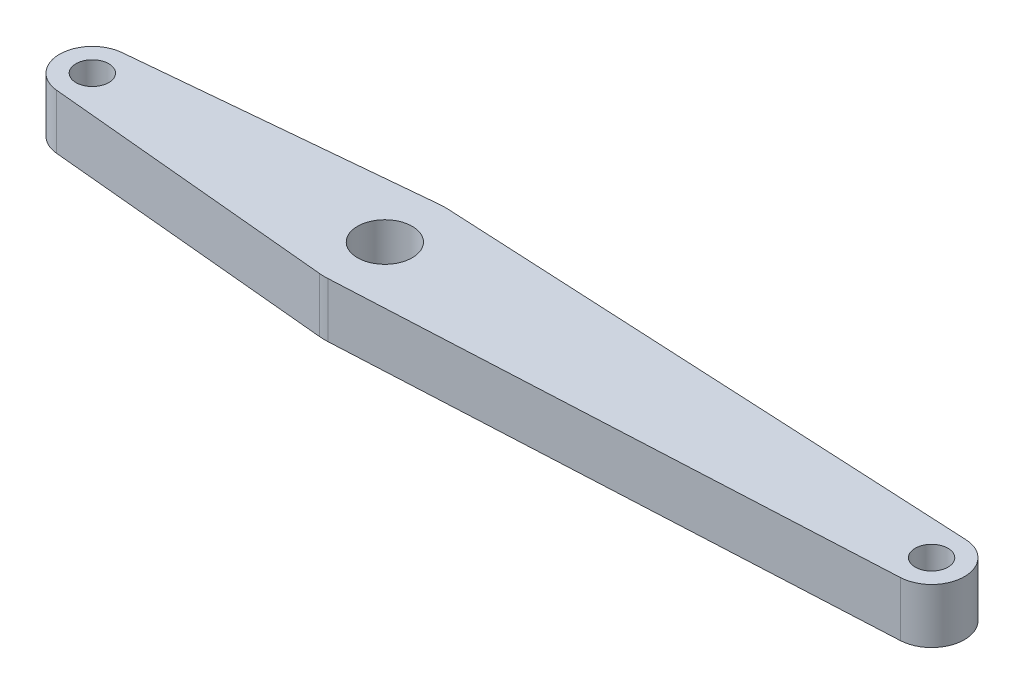
ISO-10303-21;
HEADER;
FILE_DESCRIPTION(('STEP AP214'),'2;1');
FILE_NAME('part.step','',(''),(''),'','','');
FILE_SCHEMA(('AUTOMOTIVE_DESIGN { 1 0 10303 214 1 1 1 1 }'));
ENDSEC;
DATA;
#1=APPLICATION_CONTEXT('core data for automotive mechanical design processes');
#2=APPLICATION_PROTOCOL_DEFINITION('international standard','automotive_design',2000,#1);
#3=PRODUCT_CONTEXT('',#1,'mechanical');
#4=PRODUCT('Part','Part','',(#3));
#5=PRODUCT_RELATED_PRODUCT_CATEGORY('part','',(#4));
#6=PRODUCT_DEFINITION_FORMATION('','',#4);
#7=PRODUCT_DEFINITION_CONTEXT('part definition',#1,'design');
#8=PRODUCT_DEFINITION('design','',#6,#7);
#9=PRODUCT_DEFINITION_SHAPE('','',#8);
#10=(LENGTH_UNIT() NAMED_UNIT(*) SI_UNIT(.MILLI.,.METRE.));
#11=(NAMED_UNIT(*) PLANE_ANGLE_UNIT() SI_UNIT($,.RADIAN.));
#12=(NAMED_UNIT(*) SI_UNIT($,.STERADIAN.) SOLID_ANGLE_UNIT());
#13=UNCERTAINTY_MEASURE_WITH_UNIT(LENGTH_MEASURE(1.E-05),#10,'distance_accuracy_value','');
#14=(GEOMETRIC_REPRESENTATION_CONTEXT(3) GLOBAL_UNCERTAINTY_ASSIGNED_CONTEXT((#13)) GLOBAL_UNIT_ASSIGNED_CONTEXT((#10,
#11,#12)) REPRESENTATION_CONTEXT('',''));
#15=CARTESIAN_POINT('',(0.,0.,0.));
#16=DIRECTION('',(0.,0.,1.));
#17=DIRECTION('',(1.,0.,0.));
#18=AXIS2_PLACEMENT_3D('',#15,#16,#17);
#19=CARTESIAN_POINT('',(100.,5.,0.));
#20=DIRECTION('',(0.,1.,0.));
#21=DIRECTION('',(0.,0.,1.));
#22=AXIS2_PLACEMENT_3D('',#19,#20,#21);
#23=PLANE('',#22);
#24=CARTESIAN_POINT('',(100.,5.,0.));
#25=DIRECTION('',(0.,1.,0.));
#26=DIRECTION('',(0.,0.,1.));
#27=AXIS2_PLACEMENT_3D('',#24,#25,#26);
#28=CIRCLE('',#27,3.00000000000001);
#29=CARTESIAN_POINT('',(100.,5.,3.00000000000001));
#30=VERTEX_POINT('',#29);
#31=EDGE_CURVE('E190',#30,#30,#28,.T.);
#32=ORIENTED_EDGE('',*,*,#31,.F.);
#33=EDGE_LOOP('',(#32));
#34=FACE_BOUND('',#33,.T.);
#35=CARTESIAN_POINT('',(100.,5.,0.));
#36=DIRECTION('',(0.,1.,0.));
#37=DIRECTION('',(0.,0.,1.));
#38=AXIS2_PLACEMENT_3D('',#35,#36,#37);
#39=CIRCLE('',#38,6.);
#40=CARTESIAN_POINT('',(100.3,5.,5.99249530663146));
#41=VERTEX_POINT('',#40);
#42=CARTESIAN_POINT('',(100.3,5.,-5.99249530663146));
#43=VERTEX_POINT('',#42);
#44=EDGE_CURVE('E153',#41,#43,#39,.T.);
#45=ORIENTED_EDGE('',*,*,#44,.T.);
#46=DIRECTION('',(-0.998749217771909,0.,-0.05));
#47=VECTOR('',#46,1.);
#48=CARTESIAN_POINT('',(100.3,5.,-5.99249530663146));
#49=LINE('',#48,#47);
#50=CARTESIAN_POINT('',(0.55,5.,-10.986241395491));
#51=VERTEX_POINT('',#50);
#52=EDGE_CURVE('E101',#43,#51,#49,.T.);
#53=ORIENTED_EDGE('',*,*,#52,.T.);
#54=CARTESIAN_POINT('',(0.,5.,0.));
#55=DIRECTION('',(0.,1.,0.));
#56=DIRECTION('',(0.,0.,1.));
#57=AXIS2_PLACEMENT_3D('',#54,#55,#56);
#58=CIRCLE('',#57,11.);
#59=CARTESIAN_POINT('',(-1.02803738317757,5.,-10.9518555112268));
#60=VERTEX_POINT('',#59);
#61=EDGE_CURVE('E168',#51,#60,#58,.T.);
#62=ORIENTED_EDGE('',*,*,#61,.T.);
#63=DIRECTION('',(-0.995623228293348,0.,0.0934579439252337));
#64=VECTOR('',#63,1.);
#65=CARTESIAN_POINT('',(-54.0607476635514,5.,-5.97373936976008));
#66=LINE('',#65,#64);
#67=CARTESIAN_POINT('',(-54.0607476635514,5.,-5.97373936976008));
#68=VERTEX_POINT('',#67);
#69=EDGE_CURVE('E181',#60,#68,#66,.T.);
#70=ORIENTED_EDGE('',*,*,#69,.T.);
#71=CARTESIAN_POINT('',(-53.5,5.,0.));
#72=DIRECTION('',(0.,1.,0.));
#73=DIRECTION('',(0.,0.,1.));
#74=AXIS2_PLACEMENT_3D('',#71,#72,#73);
#75=CIRCLE('',#74,5.99999999999999);
#76=CARTESIAN_POINT('',(-54.0607476635514,5.,5.97373936976009));
#77=VERTEX_POINT('',#76);
#78=EDGE_CURVE('E120',#68,#77,#75,.T.);
#79=ORIENTED_EDGE('',*,*,#78,.T.);
#80=DIRECTION('',(0.995623228293348,0.,0.0934579439252337));
#81=VECTOR('',#80,1.);
#82=CARTESIAN_POINT('',(-54.0607476635514,5.,5.97373936976008));
#83=LINE('',#82,#81);
#84=CARTESIAN_POINT('',(-1.02803738317757,5.,10.9518555112268));
#85=VERTEX_POINT('',#84);
#86=EDGE_CURVE('E114',#77,#85,#83,.T.);
#87=ORIENTED_EDGE('',*,*,#86,.T.);
#88=CARTESIAN_POINT('',(0.,5.,0.));
#89=DIRECTION('',(0.,1.,0.));
#90=DIRECTION('',(0.,0.,1.));
#91=AXIS2_PLACEMENT_3D('',#88,#89,#90);
#92=CIRCLE('',#91,11.);
#93=CARTESIAN_POINT('',(0.550000000000003,5.,10.986241395491));
#94=VERTEX_POINT('',#93);
#95=EDGE_CURVE('E118',#85,#94,#92,.T.);
#96=ORIENTED_EDGE('',*,*,#95,.T.);
#97=DIRECTION('',(0.998749217771909,0.,-0.05));
#98=VECTOR('',#97,1.);
#99=CARTESIAN_POINT('',(100.3,5.,5.99249530663146));
#100=LINE('',#99,#98);
#101=EDGE_CURVE('E58',#94,#41,#100,.T.);
#102=ORIENTED_EDGE('',*,*,#101,.T.);
#103=EDGE_LOOP('',(#45,#53,#62,#70,#79,#87,#96,#102));
#104=FACE_BOUND('',#103,.T.);
#105=CARTESIAN_POINT('',(-53.5,5.,0.));
#106=DIRECTION('',(0.,1.,0.));
#107=DIRECTION('',(0.,0.,1.));
#108=AXIS2_PLACEMENT_3D('',#105,#106,#107);
#109=CIRCLE('',#108,2.99999999999999);
#110=CARTESIAN_POINT('',(-53.5,5.,3.));
#111=VERTEX_POINT('',#110);
#112=EDGE_CURVE('E142',#111,#111,#109,.T.);
#113=ORIENTED_EDGE('',*,*,#112,.F.);
#114=EDGE_LOOP('',(#113));
#115=FACE_BOUND('',#114,.T.);
#116=CARTESIAN_POINT('',(0.,5.,0.));
#117=DIRECTION('',(0.,1.,0.));
#118=DIRECTION('',(0.,0.,1.));
#119=AXIS2_PLACEMENT_3D('',#116,#117,#118);
#120=CIRCLE('',#119,5.);
#121=CARTESIAN_POINT('',(0.,5.,5.));
#122=VERTEX_POINT('',#121);
#123=EDGE_CURVE('E196',#122,#122,#120,.T.);
#124=ORIENTED_EDGE('',*,*,#123,.F.);
#125=EDGE_LOOP('',(#124));
#126=FACE_BOUND('',#125,.T.);
#127=ADVANCED_FACE('F41',(#34,#104,#115,#126),#23,.T.);
#128=CARTESIAN_POINT('',(100.,-5.,0.));
#129=DIRECTION('',(0.,1.,0.));
#130=DIRECTION('',(0.,0.,1.));
#131=AXIS2_PLACEMENT_3D('',#128,#129,#130);
#132=PLANE('',#131);
#133=CARTESIAN_POINT('',(100.,-5.,0.));
#134=DIRECTION('',(0.,1.,0.));
#135=DIRECTION('',(0.,0.,1.));
#136=AXIS2_PLACEMENT_3D('',#133,#134,#135);
#137=CIRCLE('',#136,6.);
#138=CARTESIAN_POINT('',(100.3,-5.,5.99249530663146));
#139=VERTEX_POINT('',#138);
#140=CARTESIAN_POINT('',(100.3,-5.,-5.99249530663146));
#141=VERTEX_POINT('',#140);
#142=EDGE_CURVE('E138',#139,#141,#137,.T.);
#143=ORIENTED_EDGE('',*,*,#142,.F.);
#144=DIRECTION('',(0.998749217771909,0.,-0.05));
#145=VECTOR('',#144,1.);
#146=CARTESIAN_POINT('',(100.3,-5.,5.99249530663146));
#147=LINE('',#146,#145);
#148=CARTESIAN_POINT('',(0.550000000000003,-5.,10.986241395491));
#149=VERTEX_POINT('',#148);
#150=EDGE_CURVE('E93',#149,#139,#147,.T.);
#151=ORIENTED_EDGE('',*,*,#150,.F.);
#152=CARTESIAN_POINT('',(0.,-5.,0.));
#153=DIRECTION('',(0.,1.,0.));
#154=DIRECTION('',(0.,0.,1.));
#155=AXIS2_PLACEMENT_3D('',#152,#153,#154);
#156=CIRCLE('',#155,11.);
#157=CARTESIAN_POINT('',(-1.02803738317757,-5.,10.9518555112268));
#158=VERTEX_POINT('',#157);
#159=EDGE_CURVE('E87',#158,#149,#156,.T.);
#160=ORIENTED_EDGE('',*,*,#159,.F.);
#161=DIRECTION('',(0.995623228293348,0.,0.0934579439252337));
#162=VECTOR('',#161,1.);
#163=CARTESIAN_POINT('',(-54.0607476635514,-5.,5.97373936976008));
#164=LINE('',#163,#162);
#165=CARTESIAN_POINT('',(-54.0607476635514,-5.,5.97373936976009));
#166=VERTEX_POINT('',#165);
#167=EDGE_CURVE('E128',#166,#158,#164,.T.);
#168=ORIENTED_EDGE('',*,*,#167,.F.);
#169=CARTESIAN_POINT('',(-53.5,-5.,0.));
#170=DIRECTION('',(0.,1.,0.));
#171=DIRECTION('',(0.,0.,1.));
#172=AXIS2_PLACEMENT_3D('',#169,#170,#171);
#173=CIRCLE('',#172,5.99999999999999);
#174=CARTESIAN_POINT('',(-54.0607476635514,-5.,-5.97373936976008));
#175=VERTEX_POINT('',#174);
#176=EDGE_CURVE('E148',#175,#166,#173,.T.);
#177=ORIENTED_EDGE('',*,*,#176,.F.);
#178=DIRECTION('',(-0.995623228293348,0.,0.0934579439252337));
#179=VECTOR('',#178,1.);
#180=CARTESIAN_POINT('',(-54.0607476635514,-5.,-5.97373936976008));
#181=LINE('',#180,#179);
#182=CARTESIAN_POINT('',(-1.02803738317757,-5.,-10.9518555112268));
#183=VERTEX_POINT('',#182);
#184=EDGE_CURVE('E146',#183,#175,#181,.T.);
#185=ORIENTED_EDGE('',*,*,#184,.F.);
#186=CARTESIAN_POINT('',(0.,-5.,0.));
#187=DIRECTION('',(0.,1.,0.));
#188=DIRECTION('',(0.,0.,1.));
#189=AXIS2_PLACEMENT_3D('',#186,#187,#188);
#190=CIRCLE('',#189,11.);
#191=CARTESIAN_POINT('',(0.55,-5.,-10.986241395491));
#192=VERTEX_POINT('',#191);
#193=EDGE_CURVE('E144',#192,#183,#190,.T.);
#194=ORIENTED_EDGE('',*,*,#193,.F.);
#195=DIRECTION('',(-0.998749217771909,0.,-0.05));
#196=VECTOR('',#195,1.);
#197=CARTESIAN_POINT('',(100.3,-5.,-5.99249530663146));
#198=LINE('',#197,#196);
#199=EDGE_CURVE('E141',#141,#192,#198,.T.);
#200=ORIENTED_EDGE('',*,*,#199,.F.);
#201=EDGE_LOOP('',(#143,#151,#160,#168,#177,#185,#194,#200));
#202=FACE_BOUND('',#201,.T.);
#203=CARTESIAN_POINT('',(-53.5,-5.,0.));
#204=DIRECTION('',(0.,1.,0.));
#205=DIRECTION('',(0.,0.,1.));
#206=AXIS2_PLACEMENT_3D('',#203,#204,#205);
#207=CIRCLE('',#206,2.99999999999999);
#208=CARTESIAN_POINT('',(-53.5,-5.,3.));
#209=VERTEX_POINT('',#208);
#210=EDGE_CURVE('E187',#209,#209,#207,.T.);
#211=ORIENTED_EDGE('',*,*,#210,.T.);
#212=EDGE_LOOP('',(#211));
#213=FACE_BOUND('',#212,.T.);
#214=CARTESIAN_POINT('',(100.,-5.,0.));
#215=DIRECTION('',(0.,1.,0.));
#216=DIRECTION('',(0.,0.,1.));
#217=AXIS2_PLACEMENT_3D('',#214,#215,#216);
#218=CIRCLE('',#217,3.00000000000001);
#219=CARTESIAN_POINT('',(100.,-5.,3.00000000000001));
#220=VERTEX_POINT('',#219);
#221=EDGE_CURVE('E193',#220,#220,#218,.T.);
#222=ORIENTED_EDGE('',*,*,#221,.T.);
#223=EDGE_LOOP('',(#222));
#224=FACE_BOUND('',#223,.T.);
#225=CARTESIAN_POINT('',(0.,-5.,0.));
#226=DIRECTION('',(0.,1.,0.));
#227=DIRECTION('',(0.,0.,1.));
#228=AXIS2_PLACEMENT_3D('',#225,#226,#227);
#229=CIRCLE('',#228,5.);
#230=CARTESIAN_POINT('',(0.,-5.,5.));
#231=VERTEX_POINT('',#230);
#232=EDGE_CURVE('E199',#231,#231,#229,.T.);
#233=ORIENTED_EDGE('',*,*,#232,.T.);
#234=EDGE_LOOP('',(#233));
#235=FACE_BOUND('',#234,.T.);
#236=ADVANCED_FACE('F172',(#202,#213,#224,#235),#132,.F.);
#237=CARTESIAN_POINT('',(100.,5.,0.));
#238=DIRECTION('',(0.,-1.,0.));
#239=DIRECTION('',(0.,0.,-1.));
#240=AXIS2_PLACEMENT_3D('',#237,#238,#239);
#241=CYLINDRICAL_SURFACE('',#240,6.);
#242=ORIENTED_EDGE('',*,*,#142,.T.);
#243=DIRECTION('',(0.,-1.,0.));
#244=VECTOR('',#243,1.);
#245=CARTESIAN_POINT('',(100.3,5.,-5.99249530663146));
#246=LINE('',#245,#244);
#247=EDGE_CURVE('E11',#43,#141,#246,.T.);
#248=ORIENTED_EDGE('',*,*,#247,.F.);
#249=ORIENTED_EDGE('',*,*,#44,.F.);
#250=DIRECTION('',(0.,-1.,0.));
#251=VECTOR('',#250,1.);
#252=CARTESIAN_POINT('',(100.3,5.,5.99249530663146));
#253=LINE('',#252,#251);
#254=EDGE_CURVE('E134',#41,#139,#253,.T.);
#255=ORIENTED_EDGE('',*,*,#254,.T.);
#256=EDGE_LOOP('',(#242,#248,#249,#255));
#257=FACE_BOUND('',#256,.T.);
#258=ADVANCED_FACE('F43',(#257),#241,.T.);
#259=CARTESIAN_POINT('',(100.3,5.,-5.99249530663146));
#260=DIRECTION('',(-0.05,0.,0.998749217771909));
#261=DIRECTION('',(0.998749217771909,0.,0.05));
#262=AXIS2_PLACEMENT_3D('',#259,#260,#261);
#263=PLANE('',#262);
#264=ORIENTED_EDGE('',*,*,#199,.T.);
#265=DIRECTION('',(0.,-1.,0.));
#266=VECTOR('',#265,1.);
#267=CARTESIAN_POINT('',(0.55,5.,-10.986241395491));
#268=LINE('',#267,#266);
#269=EDGE_CURVE('E50',#51,#192,#268,.T.);
#270=ORIENTED_EDGE('',*,*,#269,.F.);
#271=ORIENTED_EDGE('',*,*,#52,.F.);
#272=ORIENTED_EDGE('',*,*,#247,.T.);
#273=EDGE_LOOP('',(#264,#270,#271,#272));
#274=FACE_BOUND('',#273,.T.);
#275=ADVANCED_FACE('F232',(#274),#263,.F.);
#276=CARTESIAN_POINT('',(0.,5.,0.));
#277=DIRECTION('',(0.,-1.,0.));
#278=DIRECTION('',(0.,0.,-1.));
#279=AXIS2_PLACEMENT_3D('',#276,#277,#278);
#280=CYLINDRICAL_SURFACE('',#279,11.);
#281=ORIENTED_EDGE('',*,*,#193,.T.);
#282=DIRECTION('',(0.,-1.,0.));
#283=VECTOR('',#282,1.);
#284=CARTESIAN_POINT('',(-1.02803738317757,5.,-10.9518555112268));
#285=LINE('',#284,#283);
#286=EDGE_CURVE('E160',#60,#183,#285,.T.);
#287=ORIENTED_EDGE('',*,*,#286,.F.);
#288=ORIENTED_EDGE('',*,*,#61,.F.);
#289=ORIENTED_EDGE('',*,*,#269,.T.);
#290=EDGE_LOOP('',(#281,#287,#288,#289));
#291=FACE_BOUND('',#290,.T.);
#292=ADVANCED_FACE('F166',(#291),#280,.T.);
#293=CARTESIAN_POINT('',(-54.0607476635514,5.,-5.97373936976008));
#294=DIRECTION('',(0.0934579439252337,0.,0.995623228293348));
#295=DIRECTION('',(0.995623228293348,0.,-0.0934579439252337));
#296=AXIS2_PLACEMENT_3D('',#293,#294,#295);
#297=PLANE('',#296);
#298=ORIENTED_EDGE('',*,*,#184,.T.);
#299=DIRECTION('',(0.,-1.,0.));
#300=VECTOR('',#299,1.);
#301=CARTESIAN_POINT('',(-54.0607476635514,5.,-5.97373936976008));
#302=LINE('',#301,#300);
#303=EDGE_CURVE('E157',#68,#175,#302,.T.);
#304=ORIENTED_EDGE('',*,*,#303,.F.);
#305=ORIENTED_EDGE('',*,*,#69,.F.);
#306=ORIENTED_EDGE('',*,*,#286,.T.);
#307=EDGE_LOOP('',(#298,#304,#305,#306));
#308=FACE_BOUND('',#307,.T.);
#309=ADVANCED_FACE('F177',(#308),#297,.F.);
#310=CARTESIAN_POINT('',(-53.5,5.,0.));
#311=DIRECTION('',(0.,-1.,0.));
#312=DIRECTION('',(0.,0.,-1.));
#313=AXIS2_PLACEMENT_3D('',#310,#311,#312);
#314=CYLINDRICAL_SURFACE('',#313,5.99999999999999);
#315=ORIENTED_EDGE('',*,*,#176,.T.);
#316=DIRECTION('',(0.,-1.,0.));
#317=VECTOR('',#316,1.);
#318=CARTESIAN_POINT('',(-54.0607476635514,5.,5.97373936976009));
#319=LINE('',#318,#317);
#320=EDGE_CURVE('E129',#77,#166,#319,.T.);
#321=ORIENTED_EDGE('',*,*,#320,.F.);
#322=ORIENTED_EDGE('',*,*,#78,.F.);
#323=ORIENTED_EDGE('',*,*,#303,.T.);
#324=EDGE_LOOP('',(#315,#321,#322,#323));
#325=FACE_BOUND('',#324,.T.);
#326=ADVANCED_FACE('F180',(#325),#314,.T.);
#327=CARTESIAN_POINT('',(-54.0607476635514,5.,5.97373936976008));
#328=DIRECTION('',(0.0934579439252337,0.,-0.995623228293348));
#329=DIRECTION('',(-0.995623228293348,0.,-0.0934579439252337));
#330=AXIS2_PLACEMENT_3D('',#327,#328,#329);
#331=PLANE('',#330);
#332=ORIENTED_EDGE('',*,*,#167,.T.);
#333=DIRECTION('',(0.,-1.,0.));
#334=VECTOR('',#333,1.);
#335=CARTESIAN_POINT('',(-1.02803738317757,5.,10.9518555112268));
#336=LINE('',#335,#334);
#337=EDGE_CURVE('E125',#85,#158,#336,.T.);
#338=ORIENTED_EDGE('',*,*,#337,.F.);
#339=ORIENTED_EDGE('',*,*,#86,.F.);
#340=ORIENTED_EDGE('',*,*,#320,.T.);
#341=EDGE_LOOP('',(#332,#338,#339,#340));
#342=FACE_BOUND('',#341,.T.);
#343=ADVANCED_FACE('F126',(#342),#331,.F.);
#344=CARTESIAN_POINT('',(0.,5.,0.));
#345=DIRECTION('',(0.,-1.,0.));
#346=DIRECTION('',(0.,0.,-1.));
#347=AXIS2_PLACEMENT_3D('',#344,#345,#346);
#348=CYLINDRICAL_SURFACE('',#347,11.);
#349=ORIENTED_EDGE('',*,*,#159,.T.);
#350=DIRECTION('',(0.,-1.,0.));
#351=VECTOR('',#350,1.);
#352=CARTESIAN_POINT('',(0.550000000000003,5.,10.986241395491));
#353=LINE('',#352,#351);
#354=EDGE_CURVE('E130',#94,#149,#353,.T.);
#355=ORIENTED_EDGE('',*,*,#354,.F.);
#356=ORIENTED_EDGE('',*,*,#95,.F.);
#357=ORIENTED_EDGE('',*,*,#337,.T.);
#358=EDGE_LOOP('',(#349,#355,#356,#357));
#359=FACE_BOUND('',#358,.T.);
#360=ADVANCED_FACE('F132',(#359),#348,.T.);
#361=CARTESIAN_POINT('',(100.3,5.,5.99249530663146));
#362=DIRECTION('',(-0.05,0.,-0.998749217771909));
#363=DIRECTION('',(-0.998749217771909,0.,0.05));
#364=AXIS2_PLACEMENT_3D('',#361,#362,#363);
#365=PLANE('',#364);
#366=ORIENTED_EDGE('',*,*,#150,.T.);
#367=ORIENTED_EDGE('',*,*,#254,.F.);
#368=ORIENTED_EDGE('',*,*,#101,.F.);
#369=ORIENTED_EDGE('',*,*,#354,.T.);
#370=EDGE_LOOP('',(#366,#367,#368,#369));
#371=FACE_BOUND('',#370,.T.);
#372=ADVANCED_FACE('F220',(#371),#365,.F.);
#373=CARTESIAN_POINT('',(-53.5,5.,0.));
#374=DIRECTION('',(0.,-1.,0.));
#375=DIRECTION('',(0.,0.,-1.));
#376=AXIS2_PLACEMENT_3D('',#373,#374,#375);
#377=CYLINDRICAL_SURFACE('',#376,2.99999999999999);
#378=ORIENTED_EDGE('',*,*,#112,.T.);
#379=EDGE_LOOP('',(#378));
#380=FACE_BOUND('',#379,.T.);
#381=ORIENTED_EDGE('',*,*,#210,.F.);
#382=EDGE_LOOP('',(#381));
#383=FACE_BOUND('',#382,.T.);
#384=ADVANCED_FACE('F217',(#380,#383),#377,.F.);
#385=CARTESIAN_POINT('',(100.,5.,0.));
#386=DIRECTION('',(0.,-1.,0.));
#387=DIRECTION('',(0.,0.,-1.));
#388=AXIS2_PLACEMENT_3D('',#385,#386,#387);
#389=CYLINDRICAL_SURFACE('',#388,3.00000000000001);
#390=ORIENTED_EDGE('',*,*,#31,.T.);
#391=EDGE_LOOP('',(#390));
#392=FACE_BOUND('',#391,.T.);
#393=ORIENTED_EDGE('',*,*,#221,.F.);
#394=EDGE_LOOP('',(#393));
#395=FACE_BOUND('',#394,.T.);
#396=ADVANCED_FACE('F295',(#392,#395),#389,.F.);
#397=CARTESIAN_POINT('',(0.,5.,0.));
#398=DIRECTION('',(0.,-1.,0.));
#399=DIRECTION('',(0.,0.,-1.));
#400=AXIS2_PLACEMENT_3D('',#397,#398,#399);
#401=CYLINDRICAL_SURFACE('',#400,5.);
#402=ORIENTED_EDGE('',*,*,#123,.T.);
#403=EDGE_LOOP('',(#402));
#404=FACE_BOUND('',#403,.T.);
#405=ORIENTED_EDGE('',*,*,#232,.F.);
#406=EDGE_LOOP('',(#405));
#407=FACE_BOUND('',#406,.T.);
#408=ADVANCED_FACE('F205',(#404,#407),#401,.F.);
#409=CLOSED_SHELL('',(#127,#236,#258,#275,#292,#309,#326,#343,#360,#372,#384,#396,#408));
#410=MANIFOLD_SOLID_BREP('B2',#409);
#411=ADVANCED_BREP_SHAPE_REPRESENTATION('',(#18,#410),#14);
#412=SHAPE_DEFINITION_REPRESENTATION(#9,#411);
ENDSEC;
END-ISO-10303-21;
